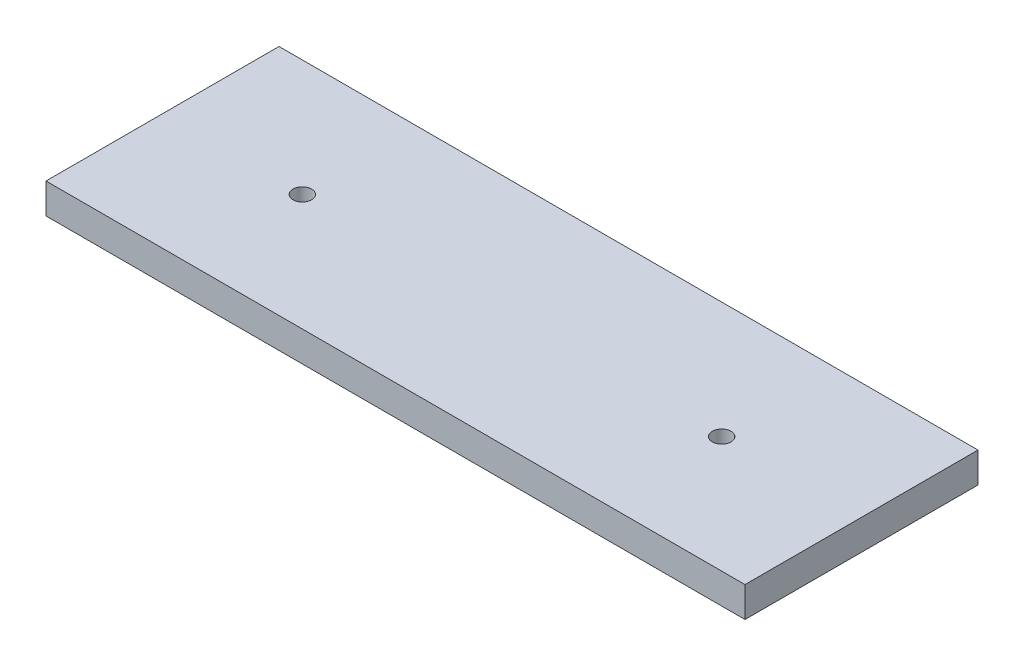
ISO-10303-21;
HEADER;
FILE_DESCRIPTION(('STEP AP214'),'2;1');
FILE_NAME('part.step','',(''),(''),'','','');
FILE_SCHEMA(('AUTOMOTIVE_DESIGN { 1 0 10303 214 1 1 1 1 }'));
ENDSEC;
DATA;
#1=APPLICATION_CONTEXT('core data for automotive mechanical design processes');
#2=APPLICATION_PROTOCOL_DEFINITION('international standard','automotive_design',2000,#1);
#3=PRODUCT_CONTEXT('',#1,'mechanical');
#4=PRODUCT('Part','Part','',(#3));
#5=PRODUCT_RELATED_PRODUCT_CATEGORY('part','',(#4));
#6=PRODUCT_DEFINITION_FORMATION('','',#4);
#7=PRODUCT_DEFINITION_CONTEXT('part definition',#1,'design');
#8=PRODUCT_DEFINITION('design','',#6,#7);
#9=PRODUCT_DEFINITION_SHAPE('','',#8);
#10=(LENGTH_UNIT() NAMED_UNIT(*) SI_UNIT(.MILLI.,.METRE.));
#11=(NAMED_UNIT(*) PLANE_ANGLE_UNIT() SI_UNIT($,.RADIAN.));
#12=(NAMED_UNIT(*) SI_UNIT($,.STERADIAN.) SOLID_ANGLE_UNIT());
#13=UNCERTAINTY_MEASURE_WITH_UNIT(LENGTH_MEASURE(1.E-05),#10,'distance_accuracy_value','');
#14=(GEOMETRIC_REPRESENTATION_CONTEXT(3) GLOBAL_UNCERTAINTY_ASSIGNED_CONTEXT((#13)) GLOBAL_UNIT_ASSIGNED_CONTEXT((#10,
#11,#12)) REPRESENTATION_CONTEXT('',''));
#15=CARTESIAN_POINT('',(0.,0.,0.));
#16=DIRECTION('',(0.,0.,1.));
#17=DIRECTION('',(1.,0.,0.));
#18=AXIS2_PLACEMENT_3D('',#15,#16,#17);
#19=CARTESIAN_POINT('',(75.,6.5,-25.));
#20=DIRECTION('',(-1.,0.,0.));
#21=DIRECTION('',(0.,0.,1.));
#22=AXIS2_PLACEMENT_3D('',#19,#20,#21);
#23=PLANE('',#22);
#24=DIRECTION('',(0.,0.,-1.));
#25=VECTOR('',#24,1.);
#26=CARTESIAN_POINT('',(75.,0.,-25.));
#27=LINE('',#26,#25);
#28=CARTESIAN_POINT('',(75.,0.,25.));
#29=VERTEX_POINT('',#28);
#30=CARTESIAN_POINT('',(75.,0.,-25.));
#31=VERTEX_POINT('',#30);
#32=EDGE_CURVE('E101',#29,#31,#27,.T.);
#33=ORIENTED_EDGE('',*,*,#32,.T.);
#34=DIRECTION('',(0.,-1.,0.));
#35=VECTOR('',#34,1.);
#36=CARTESIAN_POINT('',(75.,6.5,-25.));
#37=LINE('',#36,#35);
#38=CARTESIAN_POINT('',(75.,6.5,-25.));
#39=VERTEX_POINT('',#38);
#40=EDGE_CURVE('E92',#39,#31,#37,.T.);
#41=ORIENTED_EDGE('',*,*,#40,.F.);
#42=DIRECTION('',(0.,0.,-1.));
#43=VECTOR('',#42,1.);
#44=CARTESIAN_POINT('',(75.,6.5,-25.));
#45=LINE('',#44,#43);
#46=CARTESIAN_POINT('',(75.,6.5,25.));
#47=VERTEX_POINT('',#46);
#48=EDGE_CURVE('E86',#47,#39,#45,.T.);
#49=ORIENTED_EDGE('',*,*,#48,.F.);
#50=DIRECTION('',(0.,-1.,0.));
#51=VECTOR('',#50,1.);
#52=CARTESIAN_POINT('',(75.,6.5,25.));
#53=LINE('',#52,#51);
#54=EDGE_CURVE('E97',#47,#29,#53,.T.);
#55=ORIENTED_EDGE('',*,*,#54,.T.);
#56=EDGE_LOOP('',(#33,#41,#49,#55));
#57=FACE_BOUND('',#56,.T.);
#58=ADVANCED_FACE('F33',(#57),#23,.F.);
#59=CARTESIAN_POINT('',(-75.,6.5,-25.));
#60=DIRECTION('',(0.,0.,1.));
#61=DIRECTION('',(1.,0.,0.));
#62=AXIS2_PLACEMENT_3D('',#59,#60,#61);
#63=PLANE('',#62);
#64=DIRECTION('',(-1.,0.,0.));
#65=VECTOR('',#64,1.);
#66=CARTESIAN_POINT('',(-75.,0.,-25.));
#67=LINE('',#66,#65);
#68=CARTESIAN_POINT('',(-75.,0.,-25.));
#69=VERTEX_POINT('',#68);
#70=EDGE_CURVE('E91',#31,#69,#67,.T.);
#71=ORIENTED_EDGE('',*,*,#70,.T.);
#72=DIRECTION('',(0.,-1.,0.));
#73=VECTOR('',#72,1.);
#74=CARTESIAN_POINT('',(-75.,6.5,-25.));
#75=LINE('',#74,#73);
#76=CARTESIAN_POINT('',(-75.,6.5,-25.));
#77=VERTEX_POINT('',#76);
#78=EDGE_CURVE('E89',#77,#69,#75,.T.);
#79=ORIENTED_EDGE('',*,*,#78,.F.);
#80=DIRECTION('',(-1.,0.,0.));
#81=VECTOR('',#80,1.);
#82=CARTESIAN_POINT('',(-75.,6.5,-25.));
#83=LINE('',#82,#81);
#84=EDGE_CURVE('E81',#39,#77,#83,.T.);
#85=ORIENTED_EDGE('',*,*,#84,.F.);
#86=ORIENTED_EDGE('',*,*,#40,.T.);
#87=EDGE_LOOP('',(#71,#79,#85,#86));
#88=FACE_BOUND('',#87,.T.);
#89=ADVANCED_FACE('F90',(#88),#63,.F.);
#90=CARTESIAN_POINT('',(-75.,6.5,-25.));
#91=DIRECTION('',(1.,0.,0.));
#92=DIRECTION('',(0.,0.,-1.));
#93=AXIS2_PLACEMENT_3D('',#90,#91,#92);
#94=PLANE('',#93);
#95=DIRECTION('',(0.,0.,1.));
#96=VECTOR('',#95,1.);
#97=CARTESIAN_POINT('',(-75.,0.,-25.));
#98=LINE('',#97,#96);
#99=CARTESIAN_POINT('',(-75.,0.,25.));
#100=VERTEX_POINT('',#99);
#101=EDGE_CURVE('E67',#69,#100,#98,.T.);
#102=ORIENTED_EDGE('',*,*,#101,.T.);
#103=DIRECTION('',(0.,-1.,0.));
#104=VECTOR('',#103,1.);
#105=CARTESIAN_POINT('',(-75.,6.5,25.));
#106=LINE('',#105,#104);
#107=CARTESIAN_POINT('',(-75.,6.5,25.));
#108=VERTEX_POINT('',#107);
#109=EDGE_CURVE('E93',#108,#100,#106,.T.);
#110=ORIENTED_EDGE('',*,*,#109,.F.);
#111=DIRECTION('',(0.,0.,1.));
#112=VECTOR('',#111,1.);
#113=CARTESIAN_POINT('',(-75.,6.5,-25.));
#114=LINE('',#113,#112);
#115=EDGE_CURVE('E84',#77,#108,#114,.T.);
#116=ORIENTED_EDGE('',*,*,#115,.F.);
#117=ORIENTED_EDGE('',*,*,#78,.T.);
#118=EDGE_LOOP('',(#102,#110,#116,#117));
#119=FACE_BOUND('',#118,.T.);
#120=ADVANCED_FACE('F95',(#119),#94,.F.);
#121=CARTESIAN_POINT('',(-75.,6.5,25.));
#122=DIRECTION('',(0.,0.,-1.));
#123=DIRECTION('',(-1.,0.,0.));
#124=AXIS2_PLACEMENT_3D('',#121,#122,#123);
#125=PLANE('',#124);
#126=DIRECTION('',(1.,0.,0.));
#127=VECTOR('',#126,1.);
#128=CARTESIAN_POINT('',(-75.,0.,25.));
#129=LINE('',#128,#127);
#130=EDGE_CURVE('E73',#100,#29,#129,.T.);
#131=ORIENTED_EDGE('',*,*,#130,.T.);
#132=ORIENTED_EDGE('',*,*,#54,.F.);
#133=DIRECTION('',(1.,0.,0.));
#134=VECTOR('',#133,1.);
#135=CARTESIAN_POINT('',(-75.,6.5,25.));
#136=LINE('',#135,#134);
#137=EDGE_CURVE('E50',#108,#47,#136,.T.);
#138=ORIENTED_EDGE('',*,*,#137,.F.);
#139=ORIENTED_EDGE('',*,*,#109,.T.);
#140=EDGE_LOOP('',(#131,#132,#138,#139));
#141=FACE_BOUND('',#140,.T.);
#142=ADVANCED_FACE('F212',(#141),#125,.F.);
#143=CARTESIAN_POINT('',(0.,6.5,0.));
#144=DIRECTION('',(0.,1.,0.));
#145=DIRECTION('',(0.,0.,1.));
#146=AXIS2_PLACEMENT_3D('',#143,#144,#145);
#147=PLANE('',#146);
#148=CARTESIAN_POINT('',(45.,6.5,0.));
#149=DIRECTION('',(0.,-1.,0.));
#150=DIRECTION('',(0.,0.,-1.));
#151=AXIS2_PLACEMENT_3D('',#148,#149,#150);
#152=CIRCLE('',#151,2.);
#153=CARTESIAN_POINT('',(45.,6.5,-2.00000000000001));
#154=VERTEX_POINT('',#153);
#155=EDGE_CURVE('E149',#154,#154,#152,.T.);
#156=ORIENTED_EDGE('',*,*,#155,.T.);
#157=EDGE_LOOP('',(#156));
#158=FACE_BOUND('',#157,.T.);
#159=CARTESIAN_POINT('',(-45.,6.5,0.));
#160=DIRECTION('',(0.,-1.,0.));
#161=DIRECTION('',(0.,0.,-1.));
#162=AXIS2_PLACEMENT_3D('',#159,#160,#161);
#163=CIRCLE('',#162,2.);
#164=CARTESIAN_POINT('',(-45.,6.5,-2.00000000000002));
#165=VERTEX_POINT('',#164);
#166=EDGE_CURVE('E157',#165,#165,#163,.T.);
#167=ORIENTED_EDGE('',*,*,#166,.T.);
#168=EDGE_LOOP('',(#167));
#169=FACE_BOUND('',#168,.T.);
#170=ORIENTED_EDGE('',*,*,#48,.T.);
#171=ORIENTED_EDGE('',*,*,#84,.T.);
#172=ORIENTED_EDGE('',*,*,#115,.T.);
#173=ORIENTED_EDGE('',*,*,#137,.T.);
#174=EDGE_LOOP('',(#170,#171,#172,#173));
#175=FACE_BOUND('',#174,.T.);
#176=ADVANCED_FACE('F82',(#158,#169,#175),#147,.T.);
#177=CARTESIAN_POINT('',(0.,0.,0.));
#178=DIRECTION('',(0.,1.,0.));
#179=DIRECTION('',(0.,0.,1.));
#180=AXIS2_PLACEMENT_3D('',#177,#178,#179);
#181=PLANE('',#180);
#182=CARTESIAN_POINT('',(-45.,0.,0.));
#183=DIRECTION('',(0.,1.,0.));
#184=DIRECTION('',(0.,0.,1.));
#185=AXIS2_PLACEMENT_3D('',#182,#183,#184);
#186=CIRCLE('',#185,10.);
#187=CARTESIAN_POINT('',(-45.,0.,9.99999999999998));
#188=VERTEX_POINT('',#187);
#189=EDGE_CURVE('E42',#188,#188,#186,.T.);
#190=ORIENTED_EDGE('',*,*,#189,.T.);
#191=EDGE_LOOP('',(#190));
#192=FACE_BOUND('',#191,.T.);
#193=CARTESIAN_POINT('',(45.,0.,0.));
#194=DIRECTION('',(0.,1.,0.));
#195=DIRECTION('',(0.,0.,1.));
#196=AXIS2_PLACEMENT_3D('',#193,#194,#195);
#197=CIRCLE('',#196,10.);
#198=CARTESIAN_POINT('',(45.,0.,10.));
#199=VERTEX_POINT('',#198);
#200=EDGE_CURVE('E114',#199,#199,#197,.T.);
#201=ORIENTED_EDGE('',*,*,#200,.T.);
#202=EDGE_LOOP('',(#201));
#203=FACE_BOUND('',#202,.T.);
#204=ORIENTED_EDGE('',*,*,#32,.F.);
#205=ORIENTED_EDGE('',*,*,#130,.F.);
#206=ORIENTED_EDGE('',*,*,#101,.F.);
#207=ORIENTED_EDGE('',*,*,#70,.F.);
#208=EDGE_LOOP('',(#204,#205,#206,#207));
#209=FACE_BOUND('',#208,.T.);
#210=ADVANCED_FACE('F119',(#192,#203,#209),#181,.F.);
#211=CARTESIAN_POINT('',(45.,-17.5,0.));
#212=DIRECTION('',(0.,1.,0.));
#213=DIRECTION('',(0.,0.,1.));
#214=AXIS2_PLACEMENT_3D('',#211,#212,#213);
#215=CYLINDRICAL_SURFACE('',#214,5.);
#216=CARTESIAN_POINT('',(45.,-5.,0.));
#217=DIRECTION('',(0.,1.,0.));
#218=DIRECTION('',(0.,0.,1.));
#219=AXIS2_PLACEMENT_3D('',#216,#217,#218);
#220=CIRCLE('',#219,5.);
#221=CARTESIAN_POINT('',(45.,-5.,5.));
#222=VERTEX_POINT('',#221);
#223=EDGE_CURVE('E11',#222,#222,#220,.F.);
#224=ORIENTED_EDGE('',*,*,#223,.T.);
#225=EDGE_LOOP('',(#224));
#226=FACE_BOUND('',#225,.T.);
#227=CARTESIAN_POINT('',(45.,-17.5,0.));
#228=DIRECTION('',(0.,-1.,0.));
#229=DIRECTION('',(0.,0.,-1.));
#230=AXIS2_PLACEMENT_3D('',#227,#228,#229);
#231=CIRCLE('',#230,5.);
#232=CARTESIAN_POINT('',(45.,-17.5,-5.00000000000001));
#233=VERTEX_POINT('',#232);
#234=EDGE_CURVE('E104',#233,#233,#231,.T.);
#235=ORIENTED_EDGE('',*,*,#234,.F.);
#236=EDGE_LOOP('',(#235));
#237=FACE_BOUND('',#236,.T.);
#238=ADVANCED_FACE('F190',(#226,#237),#215,.T.);
#239=CARTESIAN_POINT('',(45.,-17.5,0.));
#240=DIRECTION('',(0.,-1.,0.));
#241=DIRECTION('',(0.,0.,-1.));
#242=AXIS2_PLACEMENT_3D('',#239,#240,#241);
#243=PLANE('',#242);
#244=CARTESIAN_POINT('',(45.,-17.5,0.));
#245=DIRECTION('',(0.,-1.,0.));
#246=DIRECTION('',(0.,0.,-1.));
#247=AXIS2_PLACEMENT_3D('',#244,#245,#246);
#248=CIRCLE('',#247,3.2);
#249=CARTESIAN_POINT('',(45.,-17.5,-3.20000000000001));
#250=VERTEX_POINT('',#249);
#251=EDGE_CURVE('E142',#250,#250,#248,.T.);
#252=ORIENTED_EDGE('',*,*,#251,.F.);
#253=EDGE_LOOP('',(#252));
#254=FACE_BOUND('',#253,.T.);
#255=ORIENTED_EDGE('',*,*,#234,.T.);
#256=EDGE_LOOP('',(#255));
#257=FACE_BOUND('',#256,.T.);
#258=ADVANCED_FACE('F131',(#254,#257),#243,.T.);
#259=CARTESIAN_POINT('',(-45.,-17.5,0.));
#260=DIRECTION('',(0.,1.,0.));
#261=DIRECTION('',(0.,0.,1.));
#262=AXIS2_PLACEMENT_3D('',#259,#260,#261);
#263=CYLINDRICAL_SURFACE('',#262,5.);
#264=CARTESIAN_POINT('',(-45.,-5.,0.));
#265=DIRECTION('',(0.,1.,0.));
#266=DIRECTION('',(0.,0.,1.));
#267=AXIS2_PLACEMENT_3D('',#264,#265,#266);
#268=CIRCLE('',#267,5.);
#269=CARTESIAN_POINT('',(-45.,-5.,4.99999999999998));
#270=VERTEX_POINT('',#269);
#271=EDGE_CURVE('E111',#270,#270,#268,.F.);
#272=ORIENTED_EDGE('',*,*,#271,.T.);
#273=EDGE_LOOP('',(#272));
#274=FACE_BOUND('',#273,.T.);
#275=CARTESIAN_POINT('',(-45.,-17.5,0.));
#276=DIRECTION('',(0.,-1.,0.));
#277=DIRECTION('',(0.,0.,-1.));
#278=AXIS2_PLACEMENT_3D('',#275,#276,#277);
#279=CIRCLE('',#278,5.);
#280=CARTESIAN_POINT('',(-45.,-17.5,-5.00000000000001));
#281=VERTEX_POINT('',#280);
#282=EDGE_CURVE('E135',#281,#281,#279,.T.);
#283=ORIENTED_EDGE('',*,*,#282,.F.);
#284=EDGE_LOOP('',(#283));
#285=FACE_BOUND('',#284,.T.);
#286=ADVANCED_FACE('F128',(#274,#285),#263,.T.);
#287=CARTESIAN_POINT('',(-45.,-17.5,0.));
#288=DIRECTION('',(0.,-1.,0.));
#289=DIRECTION('',(0.,0.,-1.));
#290=AXIS2_PLACEMENT_3D('',#287,#288,#289);
#291=PLANE('',#290);
#292=CARTESIAN_POINT('',(-45.,-17.5,0.));
#293=DIRECTION('',(0.,-1.,0.));
#294=DIRECTION('',(0.,0.,-1.));
#295=AXIS2_PLACEMENT_3D('',#292,#293,#294);
#296=CIRCLE('',#295,3.2);
#297=CARTESIAN_POINT('',(-45.,-17.5,-3.20000000000002));
#298=VERTEX_POINT('',#297);
#299=EDGE_CURVE('E145',#298,#298,#296,.T.);
#300=ORIENTED_EDGE('',*,*,#299,.F.);
#301=EDGE_LOOP('',(#300));
#302=FACE_BOUND('',#301,.T.);
#303=ORIENTED_EDGE('',*,*,#282,.T.);
#304=EDGE_LOOP('',(#303));
#305=FACE_BOUND('',#304,.T.);
#306=ADVANCED_FACE('F125',(#302,#305),#291,.T.);
#307=CARTESIAN_POINT('',(-45.,-5.,0.));
#308=DIRECTION('',(0.,1.,0.));
#309=DIRECTION('',(0.,0.,1.));
#310=AXIS2_PLACEMENT_3D('',#307,#308,#309);
#311=TOROIDAL_SURFACE('',#310,10.,5.);
#312=ORIENTED_EDGE('',*,*,#189,.F.);
#313=EDGE_LOOP('',(#312));
#314=FACE_BOUND('',#313,.T.);
#315=ORIENTED_EDGE('',*,*,#271,.F.);
#316=EDGE_LOOP('',(#315));
#317=FACE_BOUND('',#316,.T.);
#318=ADVANCED_FACE('F122',(#314,#317),#311,.F.);
#319=CARTESIAN_POINT('',(45.,-5.,0.));
#320=DIRECTION('',(0.,1.,0.));
#321=DIRECTION('',(0.,0.,1.));
#322=AXIS2_PLACEMENT_3D('',#319,#320,#321);
#323=TOROIDAL_SURFACE('',#322,10.,5.);
#324=ORIENTED_EDGE('',*,*,#200,.F.);
#325=EDGE_LOOP('',(#324));
#326=FACE_BOUND('',#325,.T.);
#327=ORIENTED_EDGE('',*,*,#223,.F.);
#328=EDGE_LOOP('',(#327));
#329=FACE_BOUND('',#328,.T.);
#330=ADVANCED_FACE('F35',(#326,#329),#323,.F.);
#331=CARTESIAN_POINT('',(-45.,0.,0.));
#332=DIRECTION('',(0.,-1.,0.));
#333=DIRECTION('',(0.,0.,-1.));
#334=AXIS2_PLACEMENT_3D('',#331,#332,#333);
#335=CYLINDRICAL_SURFACE('',#334,3.2);
#336=CARTESIAN_POINT('',(-45.,0.,0.));
#337=DIRECTION('',(0.,-1.,0.));
#338=DIRECTION('',(0.,0.,-1.));
#339=AXIS2_PLACEMENT_3D('',#336,#337,#338);
#340=CIRCLE('',#339,3.2);
#341=CARTESIAN_POINT('',(-45.,0.,-3.20000000000002));
#342=VERTEX_POINT('',#341);
#343=EDGE_CURVE('E148',#342,#342,#340,.T.);
#344=ORIENTED_EDGE('',*,*,#343,.F.);
#345=EDGE_LOOP('',(#344));
#346=FACE_BOUND('',#345,.T.);
#347=ORIENTED_EDGE('',*,*,#299,.T.);
#348=EDGE_LOOP('',(#347));
#349=FACE_BOUND('',#348,.T.);
#350=ADVANCED_FACE('F256',(#346,#349),#335,.F.);
#351=CARTESIAN_POINT('',(-45.,0.,0.));
#352=DIRECTION('',(0.,-1.,0.));
#353=DIRECTION('',(0.,0.,-1.));
#354=AXIS2_PLACEMENT_3D('',#351,#352,#353);
#355=PLANE('',#354);
#356=CARTESIAN_POINT('',(-45.,0.,0.));
#357=DIRECTION('',(0.,-1.,0.));
#358=DIRECTION('',(0.,0.,-1.));
#359=AXIS2_PLACEMENT_3D('',#356,#357,#358);
#360=CIRCLE('',#359,2.);
#361=CARTESIAN_POINT('',(-45.,0.,-2.00000000000002));
#362=VERTEX_POINT('',#361);
#363=EDGE_CURVE('E154',#362,#362,#360,.T.);
#364=ORIENTED_EDGE('',*,*,#363,.F.);
#365=EDGE_LOOP('',(#364));
#366=FACE_BOUND('',#365,.T.);
#367=ORIENTED_EDGE('',*,*,#343,.T.);
#368=EDGE_LOOP('',(#367));
#369=FACE_BOUND('',#368,.T.);
#370=ADVANCED_FACE('F184',(#366,#369),#355,.T.);
#371=CARTESIAN_POINT('',(45.,0.,0.));
#372=DIRECTION('',(0.,-1.,0.));
#373=DIRECTION('',(0.,0.,-1.));
#374=AXIS2_PLACEMENT_3D('',#371,#372,#373);
#375=CYLINDRICAL_SURFACE('',#374,3.2);
#376=CARTESIAN_POINT('',(45.,0.,0.));
#377=DIRECTION('',(0.,-1.,0.));
#378=DIRECTION('',(0.,0.,-1.));
#379=AXIS2_PLACEMENT_3D('',#376,#377,#378);
#380=CIRCLE('',#379,3.2);
#381=CARTESIAN_POINT('',(45.,0.,-3.20000000000001));
#382=VERTEX_POINT('',#381);
#383=EDGE_CURVE('E137',#382,#382,#380,.T.);
#384=ORIENTED_EDGE('',*,*,#383,.F.);
#385=EDGE_LOOP('',(#384));
#386=FACE_BOUND('',#385,.T.);
#387=ORIENTED_EDGE('',*,*,#251,.T.);
#388=EDGE_LOOP('',(#387));
#389=FACE_BOUND('',#388,.T.);
#390=ADVANCED_FACE('F178',(#386,#389),#375,.F.);
#391=CARTESIAN_POINT('',(45.,0.,0.));
#392=DIRECTION('',(0.,-1.,0.));
#393=DIRECTION('',(0.,0.,-1.));
#394=AXIS2_PLACEMENT_3D('',#391,#392,#393);
#395=PLANE('',#394);
#396=CARTESIAN_POINT('',(45.,0.,0.));
#397=DIRECTION('',(0.,-1.,0.));
#398=DIRECTION('',(0.,0.,-1.));
#399=AXIS2_PLACEMENT_3D('',#396,#397,#398);
#400=CIRCLE('',#399,2.);
#401=CARTESIAN_POINT('',(45.,0.,-2.00000000000001));
#402=VERTEX_POINT('',#401);
#403=EDGE_CURVE('E160',#402,#402,#400,.T.);
#404=ORIENTED_EDGE('',*,*,#403,.F.);
#405=EDGE_LOOP('',(#404));
#406=FACE_BOUND('',#405,.T.);
#407=ORIENTED_EDGE('',*,*,#383,.T.);
#408=EDGE_LOOP('',(#407));
#409=FACE_BOUND('',#408,.T.);
#410=ADVANCED_FACE('F175',(#406,#409),#395,.T.);
#411=CARTESIAN_POINT('',(-45.,6.5,0.));
#412=DIRECTION('',(0.,-1.,0.));
#413=DIRECTION('',(0.,0.,-1.));
#414=AXIS2_PLACEMENT_3D('',#411,#412,#413);
#415=CYLINDRICAL_SURFACE('',#414,2.);
#416=CARTESIAN_POINT('',(-45.,6.5,-2.00000000000002));
#417=CARTESIAN_POINT('',(-45.,6.43229166666667,-2.00000000000002));
#418=CARTESIAN_POINT('',(-45.,6.36458333333333,-2.00000000000002));
#419=CARTESIAN_POINT('',(-45.,6.22916666666667,-2.00000000000002));
#420=CARTESIAN_POINT('',(-45.,6.16145833333333,-2.00000000000002));
#421=CARTESIAN_POINT('',(-45.,6.02604166666667,-2.00000000000002));
#422=CARTESIAN_POINT('',(-45.,5.95833333333333,-2.00000000000002));
#423=CARTESIAN_POINT('',(-45.,5.82291666666667,-2.00000000000002));
#424=CARTESIAN_POINT('',(-45.,5.75520833333333,-2.00000000000002));
#425=CARTESIAN_POINT('',(-45.,5.61979166666667,-2.00000000000002));
#426=CARTESIAN_POINT('',(-45.,5.55208333333333,-2.00000000000002));
#427=CARTESIAN_POINT('',(-45.,5.41666666666667,-2.00000000000002));
#428=CARTESIAN_POINT('',(-45.,5.34895833333333,-2.00000000000002));
#429=CARTESIAN_POINT('',(-45.,5.21354166666667,-2.00000000000002));
#430=CARTESIAN_POINT('',(-45.,5.14583333333333,-2.00000000000002));
#431=CARTESIAN_POINT('',(-45.,5.01041666666667,-2.00000000000002));
#432=CARTESIAN_POINT('',(-45.,4.94270833333333,-2.00000000000002));
#433=CARTESIAN_POINT('',(-45.,4.80729166666667,-2.00000000000002));
#434=CARTESIAN_POINT('',(-45.,4.73958333333333,-2.00000000000002));
#435=CARTESIAN_POINT('',(-45.,4.60416666666667,-2.00000000000002));
#436=CARTESIAN_POINT('',(-45.,4.53645833333333,-2.00000000000002));
#437=CARTESIAN_POINT('',(-45.,4.40104166666667,-2.00000000000002));
#438=CARTESIAN_POINT('',(-45.,4.33333333333333,-2.00000000000002));
#439=CARTESIAN_POINT('',(-45.,4.19791666666667,-2.00000000000002));
#440=CARTESIAN_POINT('',(-45.,4.13020833333333,-2.00000000000002));
#441=CARTESIAN_POINT('',(-45.,3.99479166666667,-2.00000000000002));
#442=CARTESIAN_POINT('',(-45.,3.92708333333333,-2.00000000000002));
#443=CARTESIAN_POINT('',(-45.,3.79166666666667,-2.00000000000002));
#444=CARTESIAN_POINT('',(-45.,3.72395833333333,-2.00000000000002));
#445=CARTESIAN_POINT('',(-45.,3.58854166666667,-2.00000000000002));
#446=CARTESIAN_POINT('',(-45.,3.52083333333333,-2.00000000000002));
#447=CARTESIAN_POINT('',(-45.,3.38541666666667,-2.00000000000002));
#448=CARTESIAN_POINT('',(-45.,3.31770833333333,-2.00000000000002));
#449=CARTESIAN_POINT('',(-45.,3.18229166666667,-2.00000000000002));
#450=CARTESIAN_POINT('',(-45.,3.11458333333333,-2.00000000000002));
#451=CARTESIAN_POINT('',(-45.,2.97916666666667,-2.00000000000002));
#452=CARTESIAN_POINT('',(-45.,2.91145833333333,-2.00000000000002));
#453=CARTESIAN_POINT('',(-45.,2.77604166666667,-2.00000000000002));
#454=CARTESIAN_POINT('',(-45.,2.70833333333333,-2.00000000000002));
#455=CARTESIAN_POINT('',(-45.,2.57291666666667,-2.00000000000002));
#456=CARTESIAN_POINT('',(-45.,2.50520833333333,-2.00000000000002));
#457=CARTESIAN_POINT('',(-45.,2.36979166666667,-2.00000000000002));
#458=CARTESIAN_POINT('',(-45.,2.30208333333333,-2.00000000000002));
#459=CARTESIAN_POINT('',(-45.,2.16666666666667,-2.00000000000002));
#460=CARTESIAN_POINT('',(-45.,2.09895833333333,-2.00000000000002));
#461=CARTESIAN_POINT('',(-45.,1.96354166666667,-2.00000000000002));
#462=CARTESIAN_POINT('',(-45.,1.89583333333333,-2.00000000000002));
#463=CARTESIAN_POINT('',(-45.,1.76041666666667,-2.00000000000002));
#464=CARTESIAN_POINT('',(-45.,1.69270833333333,-2.00000000000002));
#465=CARTESIAN_POINT('',(-45.,1.55729166666667,-2.00000000000002));
#466=CARTESIAN_POINT('',(-45.,1.48958333333333,-2.00000000000002));
#467=CARTESIAN_POINT('',(-45.,1.35416666666667,-2.00000000000002));
#468=CARTESIAN_POINT('',(-45.,1.28645833333333,-2.00000000000002));
#469=CARTESIAN_POINT('',(-45.,1.15104166666667,-2.00000000000002));
#470=CARTESIAN_POINT('',(-45.,1.08333333333333,-2.00000000000002));
#471=CARTESIAN_POINT('',(-45.,0.947916666666667,-2.00000000000002));
#472=CARTESIAN_POINT('',(-45.,0.880208333333333,-2.00000000000002));
#473=CARTESIAN_POINT('',(-45.,0.744791666666667,-2.00000000000002));
#474=CARTESIAN_POINT('',(-45.,0.677083333333333,-2.00000000000002));
#475=CARTESIAN_POINT('',(-45.,0.541666666666667,-2.00000000000002));
#476=CARTESIAN_POINT('',(-45.,0.473958333333333,-2.00000000000002));
#477=CARTESIAN_POINT('',(-45.,0.338541666666667,-2.00000000000002));
#478=CARTESIAN_POINT('',(-45.,0.270833333333334,-2.00000000000002));
#479=CARTESIAN_POINT('',(-45.,0.135416666666667,-2.00000000000002));
#480=CARTESIAN_POINT('',(-45.,0.0677083333333334,-2.00000000000002));
#481=CARTESIAN_POINT('',(-45.,0.,-2.00000000000002));
#482=B_SPLINE_CURVE_WITH_KNOTS('',3,(#416,#417,#418,#419,#420,#421,#422,#423,#424,#425,#426,
#427,#428,#429,#430,#431,#432,#433,#434,#435,#436,#437,#438,#439,#440,#441,#442,#443,#444,#445,
#446,#447,#448,#449,#450,#451,#452,#453,#454,#455,#456,#457,#458,#459,#460,#461,#462,#463,#464,
#465,#466,#467,#468,#469,#470,#471,#472,#473,#474,#475,#476,#477,#478,#479,#480,#481),
.UNSPECIFIED.,.F.,.F.,(4,2,2,2,2,2,2,2,2,2,2,2,2,2,2,2,2,2,2,2,2,2,2,2,2,2,2,2,2,2,2,2,4),(0.,
0.203124999999999,0.40625,0.609375,0.8125,1.015625,1.21875,1.421875,1.625,1.828125,2.03125,
2.234375,2.4375,2.640625,2.84375,3.046875,3.25,3.453125,3.65625,3.859375,4.0625,4.265625,
4.46875,4.671875,4.875,5.078125,5.28125,5.484375,5.6875,5.890625,6.09375,6.296875,6.5),.UNSPECIFIED.);
#483=EDGE_CURVE('BSEAM171',#165,#362,#482,.T.);
#484=ORIENTED_EDGE('',*,*,#166,.F.);
#485=ORIENTED_EDGE('',*,*,#363,.T.);
#486=ORIENTED_EDGE('',*,*,#483,.T.);
#487=ORIENTED_EDGE('',*,*,#483,.F.);
#488=EDGE_LOOP('',(#484,#486,#485,#487));
#489=FACE_BOUND('',#488,.T.);
#490=ADVANCED_FACE('F171',(#489),#415,.F.);
#491=CARTESIAN_POINT('',(45.,6.5,0.));
#492=DIRECTION('',(0.,-1.,0.));
#493=DIRECTION('',(0.,0.,-1.));
#494=AXIS2_PLACEMENT_3D('',#491,#492,#493);
#495=CYLINDRICAL_SURFACE('',#494,2.);
#496=CARTESIAN_POINT('',(45.,6.5,-2.00000000000001));
#497=CARTESIAN_POINT('',(45.,6.43229166666667,-2.00000000000001));
#498=CARTESIAN_POINT('',(45.,6.36458333333333,-2.00000000000001));
#499=CARTESIAN_POINT('',(45.,6.22916666666667,-2.00000000000001));
#500=CARTESIAN_POINT('',(45.,6.16145833333333,-2.00000000000001));
#501=CARTESIAN_POINT('',(45.,6.02604166666667,-2.00000000000001));
#502=CARTESIAN_POINT('',(45.,5.95833333333333,-2.00000000000001));
#503=CARTESIAN_POINT('',(45.,5.82291666666667,-2.00000000000001));
#504=CARTESIAN_POINT('',(45.,5.75520833333333,-2.00000000000001));
#505=CARTESIAN_POINT('',(45.,5.61979166666667,-2.00000000000001));
#506=CARTESIAN_POINT('',(45.,5.55208333333333,-2.00000000000001));
#507=CARTESIAN_POINT('',(45.,5.41666666666667,-2.00000000000001));
#508=CARTESIAN_POINT('',(45.,5.34895833333333,-2.00000000000001));
#509=CARTESIAN_POINT('',(45.,5.21354166666667,-2.00000000000001));
#510=CARTESIAN_POINT('',(45.,5.14583333333333,-2.00000000000001));
#511=CARTESIAN_POINT('',(45.,5.01041666666667,-2.00000000000001));
#512=CARTESIAN_POINT('',(45.,4.94270833333333,-2.00000000000001));
#513=CARTESIAN_POINT('',(45.,4.80729166666667,-2.00000000000001));
#514=CARTESIAN_POINT('',(45.,4.73958333333333,-2.00000000000001));
#515=CARTESIAN_POINT('',(45.,4.60416666666667,-2.00000000000001));
#516=CARTESIAN_POINT('',(45.,4.53645833333333,-2.00000000000001));
#517=CARTESIAN_POINT('',(45.,4.40104166666667,-2.00000000000001));
#518=CARTESIAN_POINT('',(45.,4.33333333333333,-2.00000000000001));
#519=CARTESIAN_POINT('',(45.,4.19791666666667,-2.00000000000001));
#520=CARTESIAN_POINT('',(45.,4.13020833333333,-2.00000000000001));
#521=CARTESIAN_POINT('',(45.,3.99479166666667,-2.00000000000001));
#522=CARTESIAN_POINT('',(45.,3.92708333333333,-2.00000000000001));
#523=CARTESIAN_POINT('',(45.,3.79166666666667,-2.00000000000001));
#524=CARTESIAN_POINT('',(45.,3.72395833333333,-2.00000000000001));
#525=CARTESIAN_POINT('',(45.,3.58854166666667,-2.00000000000001));
#526=CARTESIAN_POINT('',(45.,3.52083333333333,-2.00000000000001));
#527=CARTESIAN_POINT('',(45.,3.38541666666667,-2.00000000000001));
#528=CARTESIAN_POINT('',(45.,3.31770833333333,-2.00000000000001));
#529=CARTESIAN_POINT('',(45.,3.18229166666667,-2.00000000000001));
#530=CARTESIAN_POINT('',(45.,3.11458333333333,-2.00000000000001));
#531=CARTESIAN_POINT('',(45.,2.97916666666667,-2.00000000000001));
#532=CARTESIAN_POINT('',(45.,2.91145833333333,-2.00000000000001));
#533=CARTESIAN_POINT('',(45.,2.77604166666667,-2.00000000000001));
#534=CARTESIAN_POINT('',(45.,2.70833333333333,-2.00000000000001));
#535=CARTESIAN_POINT('',(45.,2.57291666666667,-2.00000000000001));
#536=CARTESIAN_POINT('',(45.,2.50520833333333,-2.00000000000001));
#537=CARTESIAN_POINT('',(45.,2.36979166666667,-2.00000000000001));
#538=CARTESIAN_POINT('',(45.,2.30208333333333,-2.00000000000001));
#539=CARTESIAN_POINT('',(45.,2.16666666666667,-2.00000000000001));
#540=CARTESIAN_POINT('',(45.,2.09895833333333,-2.00000000000001));
#541=CARTESIAN_POINT('',(45.,1.96354166666667,-2.00000000000001));
#542=CARTESIAN_POINT('',(45.,1.89583333333333,-2.00000000000001));
#543=CARTESIAN_POINT('',(45.,1.76041666666667,-2.00000000000001));
#544=CARTESIAN_POINT('',(45.,1.69270833333333,-2.00000000000001));
#545=CARTESIAN_POINT('',(45.,1.55729166666667,-2.00000000000001));
#546=CARTESIAN_POINT('',(45.,1.48958333333333,-2.00000000000001));
#547=CARTESIAN_POINT('',(45.,1.35416666666667,-2.00000000000001));
#548=CARTESIAN_POINT('',(45.,1.28645833333333,-2.00000000000001));
#549=CARTESIAN_POINT('',(45.,1.15104166666667,-2.00000000000001));
#550=CARTESIAN_POINT('',(45.,1.08333333333333,-2.00000000000001));
#551=CARTESIAN_POINT('',(45.,0.947916666666667,-2.00000000000001));
#552=CARTESIAN_POINT('',(45.,0.880208333333333,-2.00000000000001));
#553=CARTESIAN_POINT('',(45.,0.744791666666667,-2.00000000000001));
#554=CARTESIAN_POINT('',(45.,0.677083333333333,-2.00000000000001));
#555=CARTESIAN_POINT('',(45.,0.541666666666667,-2.00000000000001));
#556=CARTESIAN_POINT('',(45.,0.473958333333333,-2.00000000000001));
#557=CARTESIAN_POINT('',(45.,0.338541666666667,-2.00000000000001));
#558=CARTESIAN_POINT('',(45.,0.270833333333334,-2.00000000000001));
#559=CARTESIAN_POINT('',(45.,0.135416666666667,-2.00000000000001));
#560=CARTESIAN_POINT('',(45.,0.0677083333333334,-2.00000000000001));
#561=CARTESIAN_POINT('',(45.,0.,-2.00000000000001));
#562=B_SPLINE_CURVE_WITH_KNOTS('',3,(#496,#497,#498,#499,#500,#501,#502,#503,#504,#505,#506,
#507,#508,#509,#510,#511,#512,#513,#514,#515,#516,#517,#518,#519,#520,#521,#522,#523,#524,#525,
#526,#527,#528,#529,#530,#531,#532,#533,#534,#535,#536,#537,#538,#539,#540,#541,#542,#543,#544,
#545,#546,#547,#548,#549,#550,#551,#552,#553,#554,#555,#556,#557,#558,#559,#560,#561),
.UNSPECIFIED.,.F.,.F.,(4,2,2,2,2,2,2,2,2,2,2,2,2,2,2,2,2,2,2,2,2,2,2,2,2,2,2,2,2,2,2,2,4),(0.,
0.203124999999999,0.40625,0.609375,0.8125,1.015625,1.21875,1.421875,1.625,1.828125,2.03125,
2.234375,2.4375,2.640625,2.84375,3.046875,3.25,3.453125,3.65625,3.859375,4.0625,4.265625,
4.46875,4.671875,4.875,5.078125,5.28125,5.484375,5.6875,5.890625,6.09375,6.296875,6.5),.UNSPECIFIED.);
#563=EDGE_CURVE('BSEAM168',#154,#402,#562,.T.);
#564=ORIENTED_EDGE('',*,*,#155,.F.);
#565=ORIENTED_EDGE('',*,*,#403,.T.);
#566=ORIENTED_EDGE('',*,*,#563,.T.);
#567=ORIENTED_EDGE('',*,*,#563,.F.);
#568=EDGE_LOOP('',(#564,#566,#565,#567));
#569=FACE_BOUND('',#568,.T.);
#570=ADVANCED_FACE('F168',(#569),#495,.F.);
#571=CLOSED_SHELL('',(#58,#89,#120,#142,#176,#210,#238,#258,#286,#306,#318,#330,#350,#370,#390,
#410,#490,#570));
#572=MANIFOLD_SOLID_BREP('B2',#571);
#573=ADVANCED_BREP_SHAPE_REPRESENTATION('',(#18,#572),#14);
#574=SHAPE_DEFINITION_REPRESENTATION(#9,#573);
ENDSEC;
END-ISO-10303-21;
